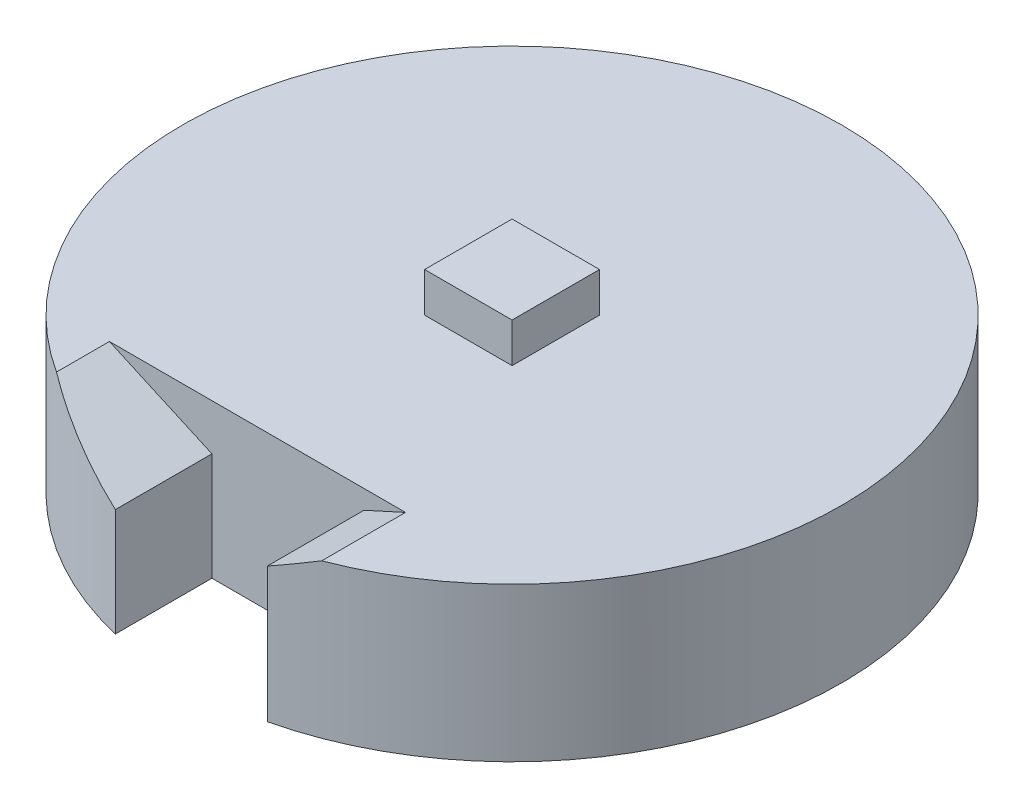
ISO-10303-21;
HEADER;
FILE_DESCRIPTION(('STEP AP214'),'2;1');
FILE_NAME('part.step','',(''),(''),'','','');
FILE_SCHEMA(('AUTOMOTIVE_DESIGN { 1 0 10303 214 1 1 1 1 }'));
ENDSEC;
DATA;
#1=APPLICATION_CONTEXT('core data for automotive mechanical design processes');
#2=APPLICATION_PROTOCOL_DEFINITION('international standard','automotive_design',2000,#1);
#3=PRODUCT_CONTEXT('',#1,'mechanical');
#4=PRODUCT('Part','Part','',(#3));
#5=PRODUCT_RELATED_PRODUCT_CATEGORY('part','',(#4));
#6=PRODUCT_DEFINITION_FORMATION('','',#4);
#7=PRODUCT_DEFINITION_CONTEXT('part definition',#1,'design');
#8=PRODUCT_DEFINITION('design','',#6,#7);
#9=PRODUCT_DEFINITION_SHAPE('','',#8);
#10=(LENGTH_UNIT() NAMED_UNIT(*) SI_UNIT(.MILLI.,.METRE.));
#11=(NAMED_UNIT(*) PLANE_ANGLE_UNIT() SI_UNIT($,.RADIAN.));
#12=(NAMED_UNIT(*) SI_UNIT($,.STERADIAN.) SOLID_ANGLE_UNIT());
#13=UNCERTAINTY_MEASURE_WITH_UNIT(LENGTH_MEASURE(1.E-05),#10,'distance_accuracy_value','');
#14=(GEOMETRIC_REPRESENTATION_CONTEXT(3) GLOBAL_UNCERTAINTY_ASSIGNED_CONTEXT((#13)) GLOBAL_UNIT_ASSIGNED_CONTEXT((#10,
#11,#12)) REPRESENTATION_CONTEXT('',''));
#15=CARTESIAN_POINT('',(0.,0.,0.));
#16=DIRECTION('',(0.,0.,1.));
#17=DIRECTION('',(1.,0.,0.));
#18=AXIS2_PLACEMENT_3D('',#15,#16,#17);
#19=CARTESIAN_POINT('',(0.,17.5,0.));
#20=DIRECTION('',(0.,1.,0.));
#21=DIRECTION('',(0.,0.,1.));
#22=AXIS2_PLACEMENT_3D('',#19,#20,#21);
#23=PLANE('',#22);
#24=DIRECTION('',(0.,0.,1.));
#25=VECTOR('',#24,1.);
#26=CARTESIAN_POINT('',(13.3735407282433,17.5,25.5));
#27=LINE('',#26,#25);
#28=CARTESIAN_POINT('',(13.3735407282433,17.5,25.5));
#29=VERTEX_POINT('',#28);
#30=CARTESIAN_POINT('',(13.3735407282433,17.5,35.0342462226607));
#31=VERTEX_POINT('',#30);
#32=EDGE_CURVE('E273',#29,#31,#27,.T.);
#33=ORIENTED_EDGE('',*,*,#32,.T.);
#34=CARTESIAN_POINT('',(0.,17.5,0.));
#35=DIRECTION('',(0.,1.,0.));
#36=DIRECTION('',(0.,0.,1.));
#37=AXIS2_PLACEMENT_3D('',#34,#35,#36);
#38=CIRCLE('',#37,37.5);
#39=CARTESIAN_POINT('',(-20.3139144915936,17.5,31.5213400417594));
#40=VERTEX_POINT('',#39);
#41=EDGE_CURVE('E54',#31,#40,#38,.T.);
#42=ORIENTED_EDGE('',*,*,#41,.T.);
#43=DIRECTION('',(0.,0.,1.));
#44=VECTOR('',#43,1.);
#45=CARTESIAN_POINT('',(-20.3139144915936,17.5,25.5));
#46=LINE('',#45,#44);
#47=CARTESIAN_POINT('',(-20.3139144915936,17.5,25.5));
#48=VERTEX_POINT('',#47);
#49=EDGE_CURVE('E272',#48,#40,#46,.T.);
#50=ORIENTED_EDGE('',*,*,#49,.F.);
#51=DIRECTION('',(-1.,0.,0.));
#52=VECTOR('',#51,1.);
#53=CARTESIAN_POINT('',(-20.3139144915936,17.5,25.5));
#54=LINE('',#53,#52);
#55=EDGE_CURVE('E249',#29,#48,#54,.T.);
#56=ORIENTED_EDGE('',*,*,#55,.F.);
#57=EDGE_LOOP('',(#33,#42,#50,#56));
#58=FACE_BOUND('',#57,.T.);
#59=DIRECTION('',(1.,0.,0.));
#60=VECTOR('',#59,1.);
#61=CARTESIAN_POINT('',(0.,17.5,-4.975));
#62=LINE('',#61,#60);
#63=CARTESIAN_POINT('',(-4.975,17.5,-4.975));
#64=VERTEX_POINT('',#63);
#65=CARTESIAN_POINT('',(4.975,17.5,-4.975));
#66=VERTEX_POINT('',#65);
#67=EDGE_CURVE('E241',#64,#66,#62,.T.);
#68=ORIENTED_EDGE('',*,*,#67,.T.);
#69=DIRECTION('',(0.,0.,1.));
#70=VECTOR('',#69,1.);
#71=CARTESIAN_POINT('',(4.975,17.5,0.));
#72=LINE('',#71,#70);
#73=CARTESIAN_POINT('',(4.975,17.5,4.975));
#74=VERTEX_POINT('',#73);
#75=EDGE_CURVE('E245',#66,#74,#72,.T.);
#76=ORIENTED_EDGE('',*,*,#75,.T.);
#77=DIRECTION('',(-1.,0.,0.));
#78=VECTOR('',#77,1.);
#79=CARTESIAN_POINT('',(0.,17.5,4.975));
#80=LINE('',#79,#78);
#81=CARTESIAN_POINT('',(-4.975,17.5,4.975));
#82=VERTEX_POINT('',#81);
#83=EDGE_CURVE('E233',#74,#82,#80,.T.);
#84=ORIENTED_EDGE('',*,*,#83,.T.);
#85=DIRECTION('',(0.,0.,-1.));
#86=VECTOR('',#85,1.);
#87=CARTESIAN_POINT('',(-4.975,17.5,0.));
#88=LINE('',#87,#86);
#89=EDGE_CURVE('E237',#82,#64,#88,.T.);
#90=ORIENTED_EDGE('',*,*,#89,.T.);
#91=EDGE_LOOP('',(#68,#76,#84,#90));
#92=FACE_BOUND('',#91,.T.);
#93=ADVANCED_FACE('F45',(#58,#92),#23,.T.);
#94=CARTESIAN_POINT('',(0.,17.5,0.));
#95=DIRECTION('',(0.,-1.,0.));
#96=DIRECTION('',(0.,0.,-1.));
#97=AXIS2_PLACEMENT_3D('',#94,#95,#96);
#98=CYLINDRICAL_SURFACE('',#97,37.5);
#99=ORIENTED_EDGE('',*,*,#41,.F.);
#100=CARTESIAN_POINT('',(0.,11.4191005122894,0.));
#101=DIRECTION('',(0.413916744789453,-0.910314741385035,0.));
#102=DIRECTION('',(-0.910314741385035,-0.413916744789453,0.));
#103=AXIS2_PLACEMENT_3D('',#100,#101,#102);
#104=ELLIPSE('',#103,41.1945432663698,37.5);
#105=CARTESIAN_POINT('',(8.65,15.3522235077286,36.4887311371607));
#106=VERTEX_POINT('',#105);
#107=EDGE_CURVE('E306',#31,#106,#104,.T.);
#108=ORIENTED_EDGE('',*,*,#107,.T.);
#109=DIRECTION('',(0.,-1.,0.));
#110=VECTOR('',#109,1.);
#111=CARTESIAN_POINT('',(8.65,17.5,36.4887311371607));
#112=LINE('',#111,#110);
#113=CARTESIAN_POINT('',(8.65,0.,36.4887311371607));
#114=VERTEX_POINT('',#113);
#115=EDGE_CURVE('E298',#106,#114,#112,.T.);
#116=ORIENTED_EDGE('',*,*,#115,.T.);
#117=CARTESIAN_POINT('',(0.,0.,0.));
#118=DIRECTION('',(0.,1.,0.));
#119=DIRECTION('',(0.,0.,1.));
#120=AXIS2_PLACEMENT_3D('',#117,#118,#119);
#121=CIRCLE('',#120,37.5);
#122=CARTESIAN_POINT('',(-8.65,0.,36.4887311371607));
#123=VERTEX_POINT('',#122);
#124=EDGE_CURVE('E310',#114,#123,#121,.T.);
#125=ORIENTED_EDGE('',*,*,#124,.T.);
#126=DIRECTION('',(0.,-1.,0.));
#127=VECTOR('',#126,1.);
#128=CARTESIAN_POINT('',(-8.65,17.5,36.4887311371607));
#129=LINE('',#128,#127);
#130=CARTESIAN_POINT('',(-8.65,12.2615130998482,36.4887311371607));
#131=VERTEX_POINT('',#130);
#132=EDGE_CURVE('E277',#123,#131,#129,.F.);
#133=ORIENTED_EDGE('',*,*,#132,.T.);
#134=CARTESIAN_POINT('',(0.,8.37663279495823,0.));
#135=DIRECTION('',(-0.409696320284977,-0.91222197142195,0.));
#136=DIRECTION('',(0.91222197142195,-0.409696320284977,0.));
#137=AXIS2_PLACEMENT_3D('',#134,#135,#136);
#138=ELLIPSE('',#137,41.1084156869691,37.5);
#139=EDGE_CURVE('E302',#131,#40,#138,.T.);
#140=ORIENTED_EDGE('',*,*,#139,.T.);
#141=EDGE_LOOP('',(#99,#108,#116,#125,#133,#140));
#142=FACE_BOUND('',#141,.T.);
#143=ADVANCED_FACE('F47',(#142),#98,.T.);
#144=CARTESIAN_POINT('',(0.,0.,0.));
#145=DIRECTION('',(0.,1.,0.));
#146=DIRECTION('',(0.,0.,1.));
#147=AXIS2_PLACEMENT_3D('',#144,#145,#146);
#148=PLANE('',#147);
#149=CARTESIAN_POINT('',(30.0180115311504,0.,0.00676759727533624));
#150=DIRECTION('',(0.,-1.,0.));
#151=DIRECTION('',(0.,0.,-1.));
#152=AXIS2_PLACEMENT_3D('',#149,#150,#151);
#153=CIRCLE('',#152,3.025);
#154=CARTESIAN_POINT('',(30.0180115311504,0.,-3.01823240272466));
#155=VERTEX_POINT('',#154);
#156=EDGE_CURVE('E365',#155,#155,#153,.T.);
#157=ORIENTED_EDGE('',*,*,#156,.F.);
#158=EDGE_LOOP('',(#157));
#159=FACE_BOUND('',#158,.T.);
#160=CARTESIAN_POINT('',(-29.9819884688496,0.,0.00676759727533257));
#161=DIRECTION('',(0.,-1.,0.));
#162=DIRECTION('',(0.,0.,-1.));
#163=AXIS2_PLACEMENT_3D('',#160,#161,#162);
#164=CIRCLE('',#163,3.025);
#165=CARTESIAN_POINT('',(-29.9819884688496,0.,-3.01823240272467));
#166=VERTEX_POINT('',#165);
#167=EDGE_CURVE('E369',#166,#166,#164,.T.);
#168=ORIENTED_EDGE('',*,*,#167,.F.);
#169=EDGE_LOOP('',(#168));
#170=FACE_BOUND('',#169,.T.);
#171=CARTESIAN_POINT('',(0.,0.,0.));
#172=DIRECTION('',(0.,1.,0.));
#173=DIRECTION('',(0.,0.,1.));
#174=AXIS2_PLACEMENT_3D('',#171,#172,#173);
#175=CIRCLE('',#174,5.);
#176=CARTESIAN_POINT('',(0.,0.,5.));
#177=VERTEX_POINT('',#176);
#178=EDGE_CURVE('E11',#177,#177,#175,.F.);
#179=ORIENTED_EDGE('',*,*,#178,.F.);
#180=EDGE_LOOP('',(#179));
#181=FACE_BOUND('',#180,.T.);
#182=ORIENTED_EDGE('',*,*,#124,.F.);
#183=DIRECTION('',(0.,0.,1.));
#184=VECTOR('',#183,1.);
#185=CARTESIAN_POINT('',(8.65,0.,25.5));
#186=LINE('',#185,#184);
#187=CARTESIAN_POINT('',(8.65,0.,25.5));
#188=VERTEX_POINT('',#187);
#189=EDGE_CURVE('E282',#188,#114,#186,.T.);
#190=ORIENTED_EDGE('',*,*,#189,.F.);
#191=DIRECTION('',(1.,0.,0.));
#192=VECTOR('',#191,1.);
#193=CARTESIAN_POINT('',(-8.65,0.,25.5));
#194=LINE('',#193,#192);
#195=CARTESIAN_POINT('',(-8.65,0.,25.5));
#196=VERTEX_POINT('',#195);
#197=EDGE_CURVE('E260',#196,#188,#194,.T.);
#198=ORIENTED_EDGE('',*,*,#197,.F.);
#199=DIRECTION('',(0.,0.,1.));
#200=VECTOR('',#199,1.);
#201=CARTESIAN_POINT('',(-8.65,0.,25.5));
#202=LINE('',#201,#200);
#203=EDGE_CURVE('E285',#196,#123,#202,.T.);
#204=ORIENTED_EDGE('',*,*,#203,.T.);
#205=EDGE_LOOP('',(#182,#190,#198,#204));
#206=FACE_BOUND('',#205,.T.);
#207=ADVANCED_FACE('F320',(#159,#170,#181,#206),#148,.F.);
#208=CARTESIAN_POINT('',(13.3735407282433,17.5,25.5));
#209=DIRECTION('',(0.413916744789453,-0.910314741385035,0.));
#210=DIRECTION('',(0.910314741385035,0.413916744789453,0.));
#211=AXIS2_PLACEMENT_3D('',#208,#209,#210);
#212=PLANE('',#211);
#213=ORIENTED_EDGE('',*,*,#32,.F.);
#214=DIRECTION('',(0.910314741385035,0.413916744789453,0.));
#215=VECTOR('',#214,1.);
#216=CARTESIAN_POINT('',(13.3735407282433,17.5,25.5));
#217=LINE('',#216,#215);
#218=CARTESIAN_POINT('',(8.65,15.3522235077286,25.5));
#219=VERTEX_POINT('',#218);
#220=EDGE_CURVE('E268',#219,#29,#217,.T.);
#221=ORIENTED_EDGE('',*,*,#220,.F.);
#222=DIRECTION('',(0.,0.,1.));
#223=VECTOR('',#222,1.);
#224=CARTESIAN_POINT('',(8.65,15.3522235077286,25.5));
#225=LINE('',#224,#223);
#226=EDGE_CURVE('E278',#219,#106,#225,.T.);
#227=ORIENTED_EDGE('',*,*,#226,.T.);
#228=ORIENTED_EDGE('',*,*,#107,.F.);
#229=EDGE_LOOP('',(#213,#221,#227,#228));
#230=FACE_BOUND('',#229,.T.);
#231=ADVANCED_FACE('F334',(#230),#212,.F.);
#232=CARTESIAN_POINT('',(-8.65,12.2615130998482,25.5));
#233=DIRECTION('',(-0.409696320284977,-0.91222197142195,0.));
#234=DIRECTION('',(0.91222197142195,-0.409696320284977,0.));
#235=AXIS2_PLACEMENT_3D('',#232,#233,#234);
#236=PLANE('',#235);
#237=DIRECTION('',(0.,0.,1.));
#238=VECTOR('',#237,1.);
#239=CARTESIAN_POINT('',(-8.65,12.2615130998482,25.5));
#240=LINE('',#239,#238);
#241=CARTESIAN_POINT('',(-8.65,12.2615130998482,25.5));
#242=VERTEX_POINT('',#241);
#243=EDGE_CURVE('E289',#242,#131,#240,.T.);
#244=ORIENTED_EDGE('',*,*,#243,.F.);
#245=DIRECTION('',(0.91222197142195,-0.409696320284977,0.));
#246=VECTOR('',#245,1.);
#247=CARTESIAN_POINT('',(-8.65,12.2615130998482,25.5));
#248=LINE('',#247,#246);
#249=EDGE_CURVE('E253',#48,#242,#248,.T.);
#250=ORIENTED_EDGE('',*,*,#249,.F.);
#251=ORIENTED_EDGE('',*,*,#49,.T.);
#252=ORIENTED_EDGE('',*,*,#139,.F.);
#253=EDGE_LOOP('',(#244,#250,#251,#252));
#254=FACE_BOUND('',#253,.T.);
#255=ADVANCED_FACE('F327',(#254),#236,.F.);
#256=CARTESIAN_POINT('',(8.65,0.,25.5));
#257=DIRECTION('',(1.,0.,0.));
#258=DIRECTION('',(0.,1.,0.));
#259=AXIS2_PLACEMENT_3D('',#256,#257,#258);
#260=PLANE('',#259);
#261=ORIENTED_EDGE('',*,*,#226,.F.);
#262=DIRECTION('',(0.,1.,0.));
#263=VECTOR('',#262,1.);
#264=CARTESIAN_POINT('',(8.65,0.,25.5));
#265=LINE('',#264,#263);
#266=EDGE_CURVE('E264',#188,#219,#265,.T.);
#267=ORIENTED_EDGE('',*,*,#266,.F.);
#268=ORIENTED_EDGE('',*,*,#189,.T.);
#269=ORIENTED_EDGE('',*,*,#115,.F.);
#270=EDGE_LOOP('',(#261,#267,#268,#269));
#271=FACE_BOUND('',#270,.T.);
#272=ADVANCED_FACE('F338',(#271),#260,.F.);
#273=CARTESIAN_POINT('',(-8.65,12.2615130998482,25.5));
#274=DIRECTION('',(-1.,0.,0.));
#275=DIRECTION('',(0.,0.,1.));
#276=AXIS2_PLACEMENT_3D('',#273,#274,#275);
#277=PLANE('',#276);
#278=ORIENTED_EDGE('',*,*,#203,.F.);
#279=DIRECTION('',(0.,-1.,0.));
#280=VECTOR('',#279,1.);
#281=CARTESIAN_POINT('',(-8.65,12.2615130998482,25.5));
#282=LINE('',#281,#280);
#283=EDGE_CURVE('E257',#242,#196,#282,.T.);
#284=ORIENTED_EDGE('',*,*,#283,.F.);
#285=ORIENTED_EDGE('',*,*,#243,.T.);
#286=ORIENTED_EDGE('',*,*,#132,.F.);
#287=EDGE_LOOP('',(#278,#284,#285,#286));
#288=FACE_BOUND('',#287,.T.);
#289=ADVANCED_FACE('F325',(#288),#277,.F.);
#290=CARTESIAN_POINT('',(0.,0.,25.5));
#291=DIRECTION('',(0.,0.,1.));
#292=DIRECTION('',(1.,0.,0.));
#293=AXIS2_PLACEMENT_3D('',#290,#291,#292);
#294=PLANE('',#293);
#295=ORIENTED_EDGE('',*,*,#55,.T.);
#296=ORIENTED_EDGE('',*,*,#249,.T.);
#297=ORIENTED_EDGE('',*,*,#283,.T.);
#298=ORIENTED_EDGE('',*,*,#197,.T.);
#299=ORIENTED_EDGE('',*,*,#266,.T.);
#300=ORIENTED_EDGE('',*,*,#220,.T.);
#301=EDGE_LOOP('',(#295,#296,#297,#298,#299,#300));
#302=FACE_BOUND('',#301,.T.);
#303=ADVANCED_FACE('F336',(#302),#294,.T.);
#304=CARTESIAN_POINT('',(4.975,22.,-4.975));
#305=DIRECTION('',(-1.,0.,0.));
#306=DIRECTION('',(0.,0.,1.));
#307=AXIS2_PLACEMENT_3D('',#304,#305,#306);
#308=PLANE('',#307);
#309=ORIENTED_EDGE('',*,*,#75,.F.);
#310=DIRECTION('',(0.,-1.,0.));
#311=VECTOR('',#310,1.);
#312=CARTESIAN_POINT('',(4.975,22.,-4.975));
#313=LINE('',#312,#311);
#314=CARTESIAN_POINT('',(4.975,22.,-4.975));
#315=VERTEX_POINT('',#314);
#316=EDGE_CURVE('E229',#315,#66,#313,.T.);
#317=ORIENTED_EDGE('',*,*,#316,.F.);
#318=DIRECTION('',(0.,0.,-1.));
#319=VECTOR('',#318,1.);
#320=CARTESIAN_POINT('',(4.975,22.,-4.975));
#321=LINE('',#320,#319);
#322=CARTESIAN_POINT('',(4.975,22.,4.975));
#323=VERTEX_POINT('',#322);
#324=EDGE_CURVE('E206',#323,#315,#321,.T.);
#325=ORIENTED_EDGE('',*,*,#324,.F.);
#326=DIRECTION('',(0.,-1.,0.));
#327=VECTOR('',#326,1.);
#328=CARTESIAN_POINT('',(4.975,22.,4.975));
#329=LINE('',#328,#327);
#330=EDGE_CURVE('E219',#323,#74,#329,.T.);
#331=ORIENTED_EDGE('',*,*,#330,.T.);
#332=EDGE_LOOP('',(#309,#317,#325,#331));
#333=FACE_BOUND('',#332,.T.);
#334=ADVANCED_FACE('F400',(#333),#308,.F.);
#335=CARTESIAN_POINT('',(-4.975,22.,-4.975));
#336=DIRECTION('',(0.,0.,1.));
#337=DIRECTION('',(1.,0.,0.));
#338=AXIS2_PLACEMENT_3D('',#335,#336,#337);
#339=PLANE('',#338);
#340=ORIENTED_EDGE('',*,*,#67,.F.);
#341=DIRECTION('',(0.,-1.,0.));
#342=VECTOR('',#341,1.);
#343=CARTESIAN_POINT('',(-4.975,22.,-4.975));
#344=LINE('',#343,#342);
#345=CARTESIAN_POINT('',(-4.975,22.,-4.975));
#346=VERTEX_POINT('',#345);
#347=EDGE_CURVE('E225',#346,#64,#344,.T.);
#348=ORIENTED_EDGE('',*,*,#347,.F.);
#349=DIRECTION('',(-1.,0.,0.));
#350=VECTOR('',#349,1.);
#351=CARTESIAN_POINT('',(-4.975,22.,-4.975));
#352=LINE('',#351,#350);
#353=EDGE_CURVE('E210',#315,#346,#352,.T.);
#354=ORIENTED_EDGE('',*,*,#353,.F.);
#355=ORIENTED_EDGE('',*,*,#316,.T.);
#356=EDGE_LOOP('',(#340,#348,#354,#355));
#357=FACE_BOUND('',#356,.T.);
#358=ADVANCED_FACE('F396',(#357),#339,.F.);
#359=CARTESIAN_POINT('',(-4.975,22.,-4.975));
#360=DIRECTION('',(1.,0.,0.));
#361=DIRECTION('',(0.,0.,-1.));
#362=AXIS2_PLACEMENT_3D('',#359,#360,#361);
#363=PLANE('',#362);
#364=ORIENTED_EDGE('',*,*,#89,.F.);
#365=DIRECTION('',(0.,-1.,0.));
#366=VECTOR('',#365,1.);
#367=CARTESIAN_POINT('',(-4.975,22.,4.975));
#368=LINE('',#367,#366);
#369=CARTESIAN_POINT('',(-4.975,22.,4.975));
#370=VERTEX_POINT('',#369);
#371=EDGE_CURVE('E69',#370,#82,#368,.T.);
#372=ORIENTED_EDGE('',*,*,#371,.F.);
#373=DIRECTION('',(0.,0.,1.));
#374=VECTOR('',#373,1.);
#375=CARTESIAN_POINT('',(-4.975,22.,-4.975));
#376=LINE('',#375,#374);
#377=EDGE_CURVE('E213',#346,#370,#376,.T.);
#378=ORIENTED_EDGE('',*,*,#377,.F.);
#379=ORIENTED_EDGE('',*,*,#347,.T.);
#380=EDGE_LOOP('',(#364,#372,#378,#379));
#381=FACE_BOUND('',#380,.T.);
#382=ADVANCED_FACE('F393',(#381),#363,.F.);
#383=CARTESIAN_POINT('',(-4.975,22.,4.975));
#384=DIRECTION('',(0.,0.,-1.));
#385=DIRECTION('',(-1.,0.,0.));
#386=AXIS2_PLACEMENT_3D('',#383,#384,#385);
#387=PLANE('',#386);
#388=ORIENTED_EDGE('',*,*,#83,.F.);
#389=ORIENTED_EDGE('',*,*,#330,.F.);
#390=DIRECTION('',(1.,0.,0.));
#391=VECTOR('',#390,1.);
#392=CARTESIAN_POINT('',(-4.975,22.,4.975));
#393=LINE('',#392,#391);
#394=EDGE_CURVE('E216',#370,#323,#393,.T.);
#395=ORIENTED_EDGE('',*,*,#394,.F.);
#396=ORIENTED_EDGE('',*,*,#371,.T.);
#397=EDGE_LOOP('',(#388,#389,#395,#396));
#398=FACE_BOUND('',#397,.T.);
#399=ADVANCED_FACE('F385',(#398),#387,.F.);
#400=CARTESIAN_POINT('',(0.,22.,0.));
#401=DIRECTION('',(0.,1.,0.));
#402=DIRECTION('',(0.,0.,1.));
#403=AXIS2_PLACEMENT_3D('',#400,#401,#402);
#404=PLANE('',#403);
#405=ORIENTED_EDGE('',*,*,#324,.T.);
#406=ORIENTED_EDGE('',*,*,#353,.T.);
#407=ORIENTED_EDGE('',*,*,#377,.T.);
#408=ORIENTED_EDGE('',*,*,#394,.T.);
#409=EDGE_LOOP('',(#405,#406,#407,#408));
#410=FACE_BOUND('',#409,.T.);
#411=ADVANCED_FACE('F375',(#410),#404,.T.);
#412=CARTESIAN_POINT('',(0.,-5.,0.));
#413=DIRECTION('',(0.,1.,0.));
#414=DIRECTION('',(0.,0.,1.));
#415=AXIS2_PLACEMENT_3D('',#412,#413,#414);
#416=CYLINDRICAL_SURFACE('',#415,5.);
#417=CARTESIAN_POINT('',(0.,-5.,0.));
#418=DIRECTION('',(0.,-1.,0.));
#419=DIRECTION('',(0.,0.,-1.));
#420=AXIS2_PLACEMENT_3D('',#417,#418,#419);
#421=CIRCLE('',#420,5.);
#422=CARTESIAN_POINT('',(0.,-5.,-5.));
#423=VERTEX_POINT('',#422);
#424=EDGE_CURVE('E197',#423,#423,#421,.T.);
#425=ORIENTED_EDGE('',*,*,#424,.F.);
#426=EDGE_LOOP('',(#425));
#427=FACE_BOUND('',#426,.T.);
#428=ORIENTED_EDGE('',*,*,#178,.T.);
#429=EDGE_LOOP('',(#428));
#430=FACE_BOUND('',#429,.T.);
#431=ADVANCED_FACE('F372',(#427,#430),#416,.T.);
#432=CARTESIAN_POINT('',(0.,-5.,0.));
#433=DIRECTION('',(0.,-1.,0.));
#434=DIRECTION('',(0.,0.,-1.));
#435=AXIS2_PLACEMENT_3D('',#432,#433,#434);
#436=PLANE('',#435);
#437=DIRECTION('',(0.,0.,1.));
#438=VECTOR('',#437,1.);
#439=CARTESIAN_POINT('',(2.53459289985249,-5.,-1.51611762881908));
#440=LINE('',#439,#438);
#441=CARTESIAN_POINT('',(2.53459289985249,-5.,-1.51611762881908));
#442=VERTEX_POINT('',#441);
#443=CARTESIAN_POINT('',(2.53459289985249,-5.,1.48388237118092));
#444=VERTEX_POINT('',#443);
#445=EDGE_CURVE('E61',#442,#444,#440,.T.);
#446=ORIENTED_EDGE('',*,*,#445,.F.);
#447=DIRECTION('',(1.,0.,0.));
#448=VECTOR('',#447,1.);
#449=CARTESIAN_POINT('',(-2.46540710014751,-5.,-1.51611762881908));
#450=LINE('',#449,#448);
#451=CARTESIAN_POINT('',(-2.46540710014751,-5.,-1.51611762881908));
#452=VERTEX_POINT('',#451);
#453=EDGE_CURVE('E188',#452,#442,#450,.T.);
#454=ORIENTED_EDGE('',*,*,#453,.F.);
#455=DIRECTION('',(0.,0.,-1.));
#456=VECTOR('',#455,1.);
#457=CARTESIAN_POINT('',(-2.46540710014751,-5.,1.48388237118092));
#458=LINE('',#457,#456);
#459=CARTESIAN_POINT('',(-2.46540710014751,-5.,1.48388237118092));
#460=VERTEX_POINT('',#459);
#461=EDGE_CURVE('E184',#460,#452,#458,.T.);
#462=ORIENTED_EDGE('',*,*,#461,.F.);
#463=DIRECTION('',(-1.,0.,0.));
#464=VECTOR('',#463,1.);
#465=CARTESIAN_POINT('',(0.0345928998524907,-5.,1.48388237118092));
#466=LINE('',#465,#464);
#467=EDGE_CURVE('E164',#444,#460,#466,.T.);
#468=ORIENTED_EDGE('',*,*,#467,.F.);
#469=EDGE_LOOP('',(#446,#454,#462,#468));
#470=FACE_BOUND('',#469,.T.);
#471=ORIENTED_EDGE('',*,*,#424,.T.);
#472=EDGE_LOOP('',(#471));
#473=FACE_BOUND('',#472,.T.);
#474=ADVANCED_FACE('F374',(#470,#473),#436,.T.);
#475=CARTESIAN_POINT('',(2.53459289985249,5.,-1.51611762881908));
#476=DIRECTION('',(1.,0.,0.));
#477=DIRECTION('',(0.,0.,-1.));
#478=AXIS2_PLACEMENT_3D('',#475,#476,#477);
#479=PLANE('',#478);
#480=ORIENTED_EDGE('',*,*,#445,.T.);
#481=DIRECTION('',(0.,-1.,0.));
#482=VECTOR('',#481,1.);
#483=CARTESIAN_POINT('',(2.53459289985249,5.,1.48388237118092));
#484=LINE('',#483,#482);
#485=CARTESIAN_POINT('',(2.53459289985249,5.,1.48388237118092));
#486=VERTEX_POINT('',#485);
#487=EDGE_CURVE('E194',#486,#444,#484,.T.);
#488=ORIENTED_EDGE('',*,*,#487,.F.);
#489=DIRECTION('',(0.,0.,1.));
#490=VECTOR('',#489,1.);
#491=CARTESIAN_POINT('',(2.53459289985249,5.,-1.51611762881908));
#492=LINE('',#491,#490);
#493=CARTESIAN_POINT('',(2.53459289985249,5.,-1.51611762881908));
#494=VERTEX_POINT('',#493);
#495=EDGE_CURVE('E156',#494,#486,#492,.T.);
#496=ORIENTED_EDGE('',*,*,#495,.F.);
#497=DIRECTION('',(0.,-1.,0.));
#498=VECTOR('',#497,1.);
#499=CARTESIAN_POINT('',(2.53459289985249,5.,-1.51611762881908));
#500=LINE('',#499,#498);
#501=EDGE_CURVE('E198',#494,#442,#500,.T.);
#502=ORIENTED_EDGE('',*,*,#501,.T.);
#503=EDGE_LOOP('',(#480,#488,#496,#502));
#504=FACE_BOUND('',#503,.T.);
#505=ADVANCED_FACE('F382',(#504),#479,.F.);
#506=CARTESIAN_POINT('',(-2.46540710014751,5.,-1.51611762881908));
#507=DIRECTION('',(0.,0.,-1.));
#508=DIRECTION('',(-1.,0.,0.));
#509=AXIS2_PLACEMENT_3D('',#506,#507,#508);
#510=PLANE('',#509);
#511=ORIENTED_EDGE('',*,*,#453,.T.);
#512=ORIENTED_EDGE('',*,*,#501,.F.);
#513=DIRECTION('',(1.,0.,0.));
#514=VECTOR('',#513,1.);
#515=CARTESIAN_POINT('',(-2.46540710014751,5.,-1.51611762881908));
#516=LINE('',#515,#514);
#517=CARTESIAN_POINT('',(-2.46540710014751,5.,-1.51611762881908));
#518=VERTEX_POINT('',#517);
#519=EDGE_CURVE('E174',#518,#494,#516,.T.);
#520=ORIENTED_EDGE('',*,*,#519,.F.);
#521=DIRECTION('',(0.,-1.,0.));
#522=VECTOR('',#521,1.);
#523=CARTESIAN_POINT('',(-2.46540710014751,5.,-1.51611762881908));
#524=LINE('',#523,#522);
#525=EDGE_CURVE('E169',#518,#452,#524,.T.);
#526=ORIENTED_EDGE('',*,*,#525,.T.);
#527=EDGE_LOOP('',(#511,#512,#520,#526));
#528=FACE_BOUND('',#527,.T.);
#529=ADVANCED_FACE('F485',(#528),#510,.F.);
#530=CARTESIAN_POINT('',(-2.46540710014751,5.,1.48388237118092));
#531=DIRECTION('',(-1.,0.,0.));
#532=DIRECTION('',(0.,0.,1.));
#533=AXIS2_PLACEMENT_3D('',#530,#531,#532);
#534=PLANE('',#533);
#535=ORIENTED_EDGE('',*,*,#461,.T.);
#536=ORIENTED_EDGE('',*,*,#525,.F.);
#537=DIRECTION('',(0.,0.,-1.));
#538=VECTOR('',#537,1.);
#539=CARTESIAN_POINT('',(-2.46540710014751,5.,1.48388237118092));
#540=LINE('',#539,#538);
#541=CARTESIAN_POINT('',(-2.46540710014751,5.,1.48388237118092));
#542=VERTEX_POINT('',#541);
#543=EDGE_CURVE('E154',#542,#518,#540,.T.);
#544=ORIENTED_EDGE('',*,*,#543,.F.);
#545=DIRECTION('',(0.,-1.,0.));
#546=VECTOR('',#545,1.);
#547=CARTESIAN_POINT('',(-2.46540710014751,5.,1.48388237118092));
#548=LINE('',#547,#546);
#549=EDGE_CURVE('E161',#542,#460,#548,.T.);
#550=ORIENTED_EDGE('',*,*,#549,.T.);
#551=EDGE_LOOP('',(#535,#536,#544,#550));
#552=FACE_BOUND('',#551,.T.);
#553=ADVANCED_FACE('F171',(#552),#534,.F.);
#554=CARTESIAN_POINT('',(0.0345928998524907,5.,1.48388237118092));
#555=DIRECTION('',(0.,0.,1.));
#556=DIRECTION('',(1.,0.,0.));
#557=AXIS2_PLACEMENT_3D('',#554,#555,#556);
#558=PLANE('',#557);
#559=ORIENTED_EDGE('',*,*,#467,.T.);
#560=ORIENTED_EDGE('',*,*,#549,.F.);
#561=DIRECTION('',(-1.,0.,0.));
#562=VECTOR('',#561,1.);
#563=CARTESIAN_POINT('',(2.53459289985249,5.,1.48388237118092));
#564=LINE('',#563,#562);
#565=EDGE_CURVE('E149',#486,#542,#564,.T.);
#566=ORIENTED_EDGE('',*,*,#565,.F.);
#567=ORIENTED_EDGE('',*,*,#487,.T.);
#568=EDGE_LOOP('',(#559,#560,#566,#567));
#569=FACE_BOUND('',#568,.T.);
#570=ADVANCED_FACE('F162',(#569),#558,.F.);
#571=CARTESIAN_POINT('',(0.,5.,0.));
#572=DIRECTION('',(0.,-1.,0.));
#573=DIRECTION('',(0.,0.,-1.));
#574=AXIS2_PLACEMENT_3D('',#571,#572,#573);
#575=PLANE('',#574);
#576=ORIENTED_EDGE('',*,*,#565,.T.);
#577=ORIENTED_EDGE('',*,*,#543,.T.);
#578=ORIENTED_EDGE('',*,*,#519,.T.);
#579=ORIENTED_EDGE('',*,*,#495,.T.);
#580=EDGE_LOOP('',(#576,#577,#578,#579));
#581=FACE_BOUND('',#580,.T.);
#582=ADVANCED_FACE('F151',(#581),#575,.T.);
#583=CARTESIAN_POINT('',(-29.9819884688496,1.6,0.00676759727533257));
#584=DIRECTION('',(0.,-1.,0.));
#585=DIRECTION('',(0.,0.,-1.));
#586=AXIS2_PLACEMENT_3D('',#583,#584,#585);
#587=CYLINDRICAL_SURFACE('',#586,3.025);
#588=CARTESIAN_POINT('',(-29.9819884688496,1.6,0.00676759727533257));
#589=DIRECTION('',(0.,-1.,0.));
#590=DIRECTION('',(0.,0.,-1.));
#591=AXIS2_PLACEMENT_3D('',#588,#589,#590);
#592=CIRCLE('',#591,3.025);
#593=CARTESIAN_POINT('',(-29.9819884688496,1.6,-3.01823240272467));
#594=VERTEX_POINT('',#593);
#595=EDGE_CURVE('E563',#594,#594,#592,.T.);
#596=ORIENTED_EDGE('',*,*,#595,.F.);
#597=EDGE_LOOP('',(#596));
#598=FACE_BOUND('',#597,.T.);
#599=ORIENTED_EDGE('',*,*,#167,.T.);
#600=EDGE_LOOP('',(#599));
#601=FACE_BOUND('',#600,.T.);
#602=ADVANCED_FACE('F514',(#598,#601),#587,.F.);
#603=CARTESIAN_POINT('',(-29.9819884688496,1.6,0.00676759727533257));
#604=DIRECTION('',(0.,-1.,0.));
#605=DIRECTION('',(0.,0.,-1.));
#606=AXIS2_PLACEMENT_3D('',#603,#604,#605);
#607=PLANE('',#606);
#608=ORIENTED_EDGE('',*,*,#595,.T.);
#609=EDGE_LOOP('',(#608));
#610=FACE_BOUND('',#609,.T.);
#611=ADVANCED_FACE('F521',(#610),#607,.T.);
#612=CARTESIAN_POINT('',(30.0180115311504,1.6,0.00676759727533624));
#613=DIRECTION('',(0.,-1.,0.));
#614=DIRECTION('',(0.,0.,-1.));
#615=AXIS2_PLACEMENT_3D('',#612,#613,#614);
#616=CYLINDRICAL_SURFACE('',#615,3.025);
#617=CARTESIAN_POINT('',(30.0180115311504,1.6,0.00676759727533624));
#618=DIRECTION('',(0.,-1.,0.));
#619=DIRECTION('',(0.,0.,-1.));
#620=AXIS2_PLACEMENT_3D('',#617,#618,#619);
#621=CIRCLE('',#620,3.025);
#622=CARTESIAN_POINT('',(30.0180115311504,1.6,-3.01823240272466));
#623=VERTEX_POINT('',#622);
#624=EDGE_CURVE('E185',#623,#623,#621,.T.);
#625=ORIENTED_EDGE('',*,*,#624,.F.);
#626=EDGE_LOOP('',(#625));
#627=FACE_BOUND('',#626,.T.);
#628=ORIENTED_EDGE('',*,*,#156,.T.);
#629=EDGE_LOOP('',(#628));
#630=FACE_BOUND('',#629,.T.);
#631=ADVANCED_FACE('F530',(#627,#630),#616,.F.);
#632=CARTESIAN_POINT('',(30.0180115311504,1.6,0.00676759727533624));
#633=DIRECTION('',(0.,-1.,0.));
#634=DIRECTION('',(0.,0.,-1.));
#635=AXIS2_PLACEMENT_3D('',#632,#633,#634);
#636=PLANE('',#635);
#637=ORIENTED_EDGE('',*,*,#624,.T.);
#638=EDGE_LOOP('',(#637));
#639=FACE_BOUND('',#638,.T.);
#640=ADVANCED_FACE('F539',(#639),#636,.T.);
#641=CLOSED_SHELL('',(#93,#143,#207,#231,#255,#272,#289,#303,#334,#358,#382,#399,#411,#431,#474,
#505,#529,#553,#570,#582,#602,#611,#631,#640));
#642=MANIFOLD_SOLID_BREP('B2',#641);
#643=ADVANCED_BREP_SHAPE_REPRESENTATION('',(#18,#642),#14);
#644=SHAPE_DEFINITION_REPRESENTATION(#9,#643);
ENDSEC;
END-ISO-10303-21;
